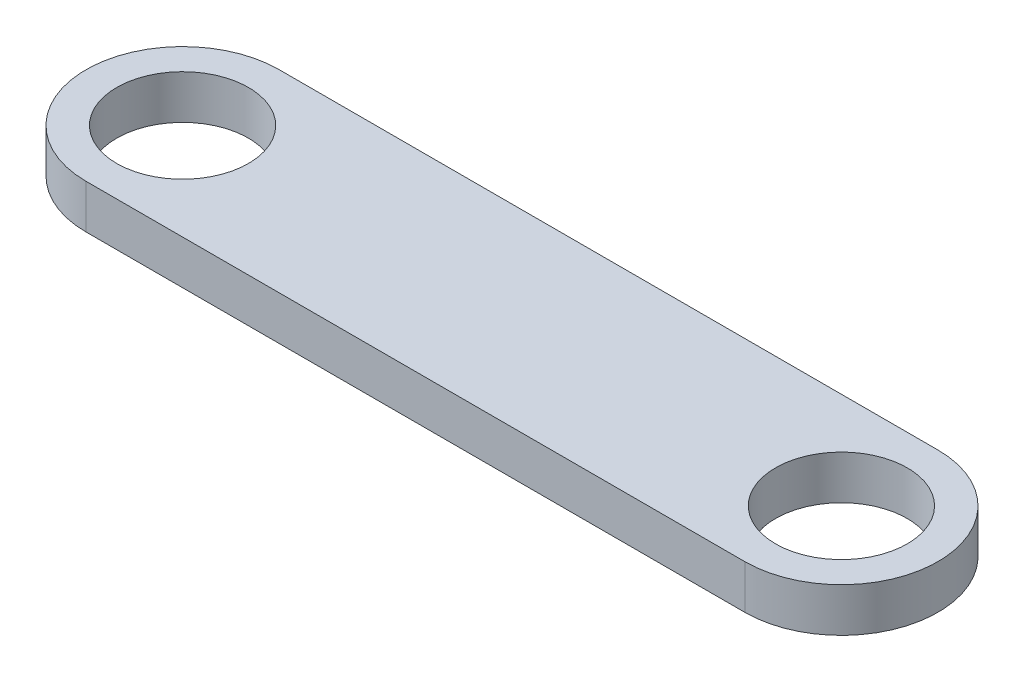
ISO-10303-21;
HEADER;
FILE_DESCRIPTION(('STEP AP214'),'2;1');
FILE_NAME('part.step','',(''),(''),'','','');
FILE_SCHEMA(('AUTOMOTIVE_DESIGN { 1 0 10303 214 1 1 1 1 }'));
ENDSEC;
DATA;
#1=APPLICATION_CONTEXT('core data for automotive mechanical design processes');
#2=APPLICATION_PROTOCOL_DEFINITION('international standard','automotive_design',2000,#1);
#3=PRODUCT_CONTEXT('',#1,'mechanical');
#4=PRODUCT('Part','Part','',(#3));
#5=PRODUCT_RELATED_PRODUCT_CATEGORY('part','',(#4));
#6=PRODUCT_DEFINITION_FORMATION('','',#4);
#7=PRODUCT_DEFINITION_CONTEXT('part definition',#1,'design');
#8=PRODUCT_DEFINITION('design','',#6,#7);
#9=PRODUCT_DEFINITION_SHAPE('','',#8);
#10=(LENGTH_UNIT() NAMED_UNIT(*) SI_UNIT(.MILLI.,.METRE.));
#11=(NAMED_UNIT(*) PLANE_ANGLE_UNIT() SI_UNIT($,.RADIAN.));
#12=(NAMED_UNIT(*) SI_UNIT($,.STERADIAN.) SOLID_ANGLE_UNIT());
#13=UNCERTAINTY_MEASURE_WITH_UNIT(LENGTH_MEASURE(1.E-05),#10,'distance_accuracy_value','');
#14=(GEOMETRIC_REPRESENTATION_CONTEXT(3) GLOBAL_UNCERTAINTY_ASSIGNED_CONTEXT((#13)) GLOBAL_UNIT_ASSIGNED_CONTEXT((#10,
#11,#12)) REPRESENTATION_CONTEXT('',''));
#15=CARTESIAN_POINT('',(0.,0.,0.));
#16=DIRECTION('',(0.,0.,1.));
#17=DIRECTION('',(1.,0.,0.));
#18=AXIS2_PLACEMENT_3D('',#15,#16,#17);
#19=CARTESIAN_POINT('',(-7.5,1.,0.));
#20=DIRECTION('',(0.,1.,0.));
#21=DIRECTION('',(0.,0.,1.));
#22=AXIS2_PLACEMENT_3D('',#19,#20,#21);
#23=PLANE('',#22);
#24=CARTESIAN_POINT('',(-7.5,1.,0.));
#25=DIRECTION('',(0.,1.,0.));
#26=DIRECTION('',(0.,0.,1.));
#27=AXIS2_PLACEMENT_3D('',#24,#25,#26);
#28=CIRCLE('',#27,1.5);
#29=CARTESIAN_POINT('',(-7.5,1.,1.5));
#30=VERTEX_POINT('',#29);
#31=EDGE_CURVE('E99',#30,#30,#28,.T.);
#32=ORIENTED_EDGE('',*,*,#31,.F.);
#33=EDGE_LOOP('',(#32));
#34=FACE_BOUND('',#33,.T.);
#35=CARTESIAN_POINT('',(-7.5,1.,0.));
#36=DIRECTION('',(0.,1.,0.));
#37=DIRECTION('',(0.,0.,1.));
#38=AXIS2_PLACEMENT_3D('',#35,#36,#37);
#39=CIRCLE('',#38,2.2);
#40=CARTESIAN_POINT('',(-7.5,1.,-2.2));
#41=VERTEX_POINT('',#40);
#42=CARTESIAN_POINT('',(-7.5,1.,2.2));
#43=VERTEX_POINT('',#42);
#44=EDGE_CURVE('E84',#41,#43,#39,.T.);
#45=ORIENTED_EDGE('',*,*,#44,.T.);
#46=DIRECTION('',(1.,0.,0.));
#47=VECTOR('',#46,1.);
#48=CARTESIAN_POINT('',(-7.5,1.,2.2));
#49=LINE('',#48,#47);
#50=CARTESIAN_POINT('',(7.5,1.,2.2));
#51=VERTEX_POINT('',#50);
#52=EDGE_CURVE('E79',#43,#51,#49,.T.);
#53=ORIENTED_EDGE('',*,*,#52,.T.);
#54=CARTESIAN_POINT('',(7.5,1.,0.));
#55=DIRECTION('',(0.,1.,0.));
#56=DIRECTION('',(0.,0.,1.));
#57=AXIS2_PLACEMENT_3D('',#54,#55,#56);
#58=CIRCLE('',#57,2.2);
#59=CARTESIAN_POINT('',(7.5,1.,-2.2));
#60=VERTEX_POINT('',#59);
#61=EDGE_CURVE('E82',#51,#60,#58,.T.);
#62=ORIENTED_EDGE('',*,*,#61,.T.);
#63=DIRECTION('',(-1.,0.,0.));
#64=VECTOR('',#63,1.);
#65=CARTESIAN_POINT('',(-7.5,1.,-2.2));
#66=LINE('',#65,#64);
#67=EDGE_CURVE('E49',#60,#41,#66,.T.);
#68=ORIENTED_EDGE('',*,*,#67,.T.);
#69=EDGE_LOOP('',(#45,#53,#62,#68));
#70=FACE_BOUND('',#69,.T.);
#71=CARTESIAN_POINT('',(7.5,1.,0.));
#72=DIRECTION('',(0.,1.,0.));
#73=DIRECTION('',(0.,0.,1.));
#74=AXIS2_PLACEMENT_3D('',#71,#72,#73);
#75=CIRCLE('',#74,1.5);
#76=CARTESIAN_POINT('',(7.5,1.,1.5));
#77=VERTEX_POINT('',#76);
#78=EDGE_CURVE('E114',#77,#77,#75,.T.);
#79=ORIENTED_EDGE('',*,*,#78,.F.);
#80=EDGE_LOOP('',(#79));
#81=FACE_BOUND('',#80,.T.);
#82=ADVANCED_FACE('F32',(#34,#70,#81),#23,.T.);
#83=CARTESIAN_POINT('',(-7.5,0.,0.));
#84=DIRECTION('',(0.,1.,0.));
#85=DIRECTION('',(0.,0.,1.));
#86=AXIS2_PLACEMENT_3D('',#83,#84,#85);
#87=PLANE('',#86);
#88=CARTESIAN_POINT('',(-7.5,0.,0.));
#89=DIRECTION('',(0.,1.,0.));
#90=DIRECTION('',(0.,0.,1.));
#91=AXIS2_PLACEMENT_3D('',#88,#89,#90);
#92=CIRCLE('',#91,2.2);
#93=CARTESIAN_POINT('',(-7.5,0.,-2.2));
#94=VERTEX_POINT('',#93);
#95=CARTESIAN_POINT('',(-7.5,0.,2.2));
#96=VERTEX_POINT('',#95);
#97=EDGE_CURVE('E96',#94,#96,#92,.T.);
#98=ORIENTED_EDGE('',*,*,#97,.F.);
#99=DIRECTION('',(-1.,0.,0.));
#100=VECTOR('',#99,1.);
#101=CARTESIAN_POINT('',(-7.5,0.,-2.2));
#102=LINE('',#101,#100);
#103=CARTESIAN_POINT('',(7.5,0.,-2.2));
#104=VERTEX_POINT('',#103);
#105=EDGE_CURVE('E72',#104,#94,#102,.T.);
#106=ORIENTED_EDGE('',*,*,#105,.F.);
#107=CARTESIAN_POINT('',(7.5,0.,0.));
#108=DIRECTION('',(0.,1.,0.));
#109=DIRECTION('',(0.,0.,1.));
#110=AXIS2_PLACEMENT_3D('',#107,#108,#109);
#111=CIRCLE('',#110,2.2);
#112=CARTESIAN_POINT('',(7.5,0.,2.2));
#113=VERTEX_POINT('',#112);
#114=EDGE_CURVE('E66',#113,#104,#111,.T.);
#115=ORIENTED_EDGE('',*,*,#114,.F.);
#116=DIRECTION('',(1.,0.,0.));
#117=VECTOR('',#116,1.);
#118=CARTESIAN_POINT('',(-7.5,0.,2.2));
#119=LINE('',#118,#117);
#120=EDGE_CURVE('E88',#96,#113,#119,.T.);
#121=ORIENTED_EDGE('',*,*,#120,.F.);
#122=EDGE_LOOP('',(#98,#106,#115,#121));
#123=FACE_BOUND('',#122,.T.);
#124=CARTESIAN_POINT('',(-7.5,0.,0.));
#125=DIRECTION('',(0.,1.,0.));
#126=DIRECTION('',(0.,0.,1.));
#127=AXIS2_PLACEMENT_3D('',#124,#125,#126);
#128=CIRCLE('',#127,1.5);
#129=CARTESIAN_POINT('',(-7.5,0.,1.5));
#130=VERTEX_POINT('',#129);
#131=EDGE_CURVE('E111',#130,#130,#128,.T.);
#132=ORIENTED_EDGE('',*,*,#131,.T.);
#133=EDGE_LOOP('',(#132));
#134=FACE_BOUND('',#133,.T.);
#135=CARTESIAN_POINT('',(7.5,0.,0.));
#136=DIRECTION('',(0.,1.,0.));
#137=DIRECTION('',(0.,0.,1.));
#138=AXIS2_PLACEMENT_3D('',#135,#136,#137);
#139=CIRCLE('',#138,1.5);
#140=CARTESIAN_POINT('',(7.5,0.,1.5));
#141=VERTEX_POINT('',#140);
#142=EDGE_CURVE('E117',#141,#141,#139,.T.);
#143=ORIENTED_EDGE('',*,*,#142,.T.);
#144=EDGE_LOOP('',(#143));
#145=FACE_BOUND('',#144,.T.);
#146=ADVANCED_FACE('F107',(#123,#134,#145),#87,.F.);
#147=CARTESIAN_POINT('',(-7.5,1.,0.));
#148=DIRECTION('',(0.,-1.,0.));
#149=DIRECTION('',(0.,0.,-1.));
#150=AXIS2_PLACEMENT_3D('',#147,#148,#149);
#151=CYLINDRICAL_SURFACE('',#150,2.2);
#152=ORIENTED_EDGE('',*,*,#97,.T.);
#153=DIRECTION('',(0.,-1.,0.));
#154=VECTOR('',#153,1.);
#155=CARTESIAN_POINT('',(-7.5,1.,2.2));
#156=LINE('',#155,#154);
#157=EDGE_CURVE('E11',#43,#96,#156,.T.);
#158=ORIENTED_EDGE('',*,*,#157,.F.);
#159=ORIENTED_EDGE('',*,*,#44,.F.);
#160=DIRECTION('',(0.,-1.,0.));
#161=VECTOR('',#160,1.);
#162=CARTESIAN_POINT('',(-7.5,1.,-2.2));
#163=LINE('',#162,#161);
#164=EDGE_CURVE('E92',#41,#94,#163,.T.);
#165=ORIENTED_EDGE('',*,*,#164,.T.);
#166=EDGE_LOOP('',(#152,#158,#159,#165));
#167=FACE_BOUND('',#166,.T.);
#168=ADVANCED_FACE('F34',(#167),#151,.T.);
#169=CARTESIAN_POINT('',(-7.5,1.,2.2));
#170=DIRECTION('',(0.,0.,-1.));
#171=DIRECTION('',(-1.,0.,0.));
#172=AXIS2_PLACEMENT_3D('',#169,#170,#171);
#173=PLANE('',#172);
#174=ORIENTED_EDGE('',*,*,#120,.T.);
#175=DIRECTION('',(0.,-1.,0.));
#176=VECTOR('',#175,1.);
#177=CARTESIAN_POINT('',(7.5,1.,2.2));
#178=LINE('',#177,#176);
#179=EDGE_CURVE('E41',#51,#113,#178,.T.);
#180=ORIENTED_EDGE('',*,*,#179,.F.);
#181=ORIENTED_EDGE('',*,*,#52,.F.);
#182=ORIENTED_EDGE('',*,*,#157,.T.);
#183=EDGE_LOOP('',(#174,#180,#181,#182));
#184=FACE_BOUND('',#183,.T.);
#185=ADVANCED_FACE('F87',(#184),#173,.F.);
#186=CARTESIAN_POINT('',(7.5,1.,0.));
#187=DIRECTION('',(0.,-1.,0.));
#188=DIRECTION('',(0.,0.,-1.));
#189=AXIS2_PLACEMENT_3D('',#186,#187,#188);
#190=CYLINDRICAL_SURFACE('',#189,2.2);
#191=ORIENTED_EDGE('',*,*,#114,.T.);
#192=DIRECTION('',(0.,-1.,0.));
#193=VECTOR('',#192,1.);
#194=CARTESIAN_POINT('',(7.5,1.,-2.2));
#195=LINE('',#194,#193);
#196=EDGE_CURVE('E89',#60,#104,#195,.T.);
#197=ORIENTED_EDGE('',*,*,#196,.F.);
#198=ORIENTED_EDGE('',*,*,#61,.F.);
#199=ORIENTED_EDGE('',*,*,#179,.T.);
#200=EDGE_LOOP('',(#191,#197,#198,#199));
#201=FACE_BOUND('',#200,.T.);
#202=ADVANCED_FACE('F90',(#201),#190,.T.);
#203=CARTESIAN_POINT('',(-7.5,1.,-2.2));
#204=DIRECTION('',(0.,0.,1.));
#205=DIRECTION('',(1.,0.,0.));
#206=AXIS2_PLACEMENT_3D('',#203,#204,#205);
#207=PLANE('',#206);
#208=ORIENTED_EDGE('',*,*,#105,.T.);
#209=ORIENTED_EDGE('',*,*,#164,.F.);
#210=ORIENTED_EDGE('',*,*,#67,.F.);
#211=ORIENTED_EDGE('',*,*,#196,.T.);
#212=EDGE_LOOP('',(#208,#209,#210,#211));
#213=FACE_BOUND('',#212,.T.);
#214=ADVANCED_FACE('F104',(#213),#207,.F.);
#215=CARTESIAN_POINT('',(-7.5,1.,0.));
#216=DIRECTION('',(0.,-1.,0.));
#217=DIRECTION('',(0.,0.,-1.));
#218=AXIS2_PLACEMENT_3D('',#215,#216,#217);
#219=CYLINDRICAL_SURFACE('',#218,1.5);
#220=ORIENTED_EDGE('',*,*,#31,.T.);
#221=EDGE_LOOP('',(#220));
#222=FACE_BOUND('',#221,.T.);
#223=ORIENTED_EDGE('',*,*,#131,.F.);
#224=EDGE_LOOP('',(#223));
#225=FACE_BOUND('',#224,.T.);
#226=ADVANCED_FACE('F134',(#222,#225),#219,.F.);
#227=CARTESIAN_POINT('',(7.5,1.,0.));
#228=DIRECTION('',(0.,-1.,0.));
#229=DIRECTION('',(0.,0.,-1.));
#230=AXIS2_PLACEMENT_3D('',#227,#228,#229);
#231=CYLINDRICAL_SURFACE('',#230,1.5);
#232=ORIENTED_EDGE('',*,*,#78,.T.);
#233=EDGE_LOOP('',(#232));
#234=FACE_BOUND('',#233,.T.);
#235=ORIENTED_EDGE('',*,*,#142,.F.);
#236=EDGE_LOOP('',(#235));
#237=FACE_BOUND('',#236,.T.);
#238=ADVANCED_FACE('F123',(#234,#237),#231,.F.);
#239=CLOSED_SHELL('',(#82,#146,#168,#185,#202,#214,#226,#238));
#240=MANIFOLD_SOLID_BREP('B2',#239);
#241=ADVANCED_BREP_SHAPE_REPRESENTATION('',(#18,#240),#14);
#242=SHAPE_DEFINITION_REPRESENTATION(#9,#241);
ENDSEC;
END-ISO-10303-21;
